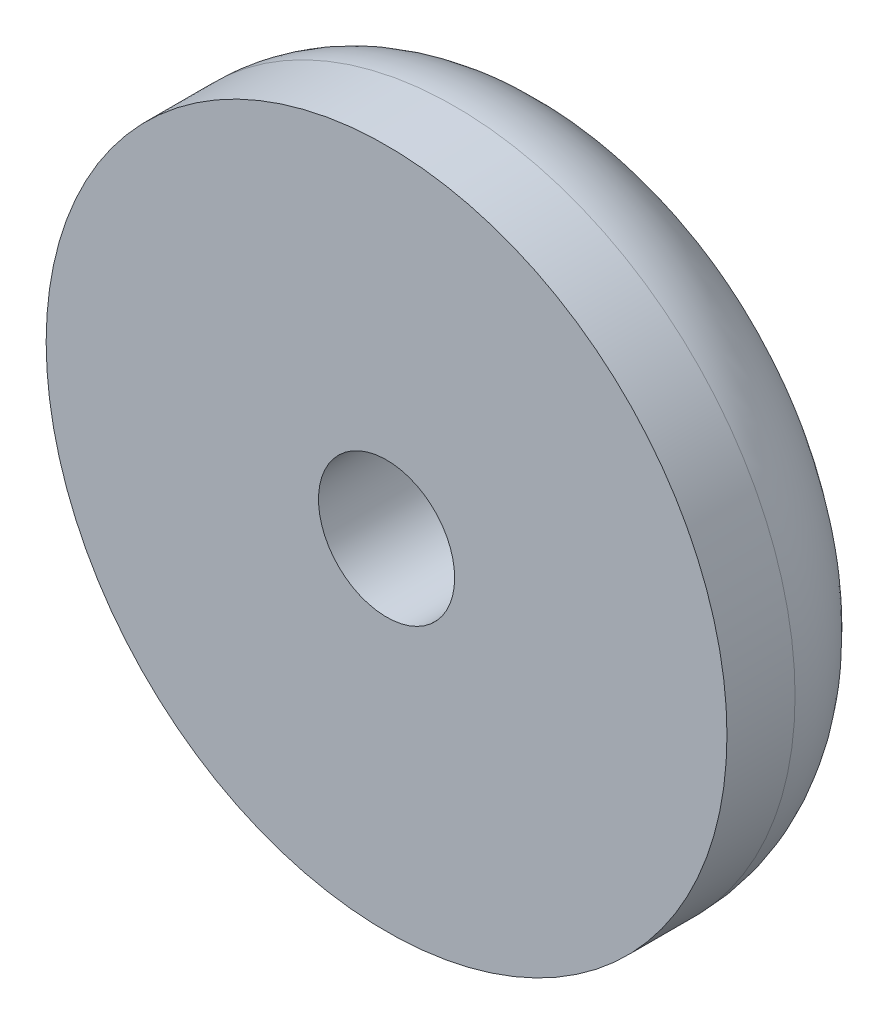
ISO-10303-21;
HEADER;
FILE_DESCRIPTION(('STEP AP214'),'2;1');
FILE_NAME('part.step','',(''),(''),'','','');
FILE_SCHEMA(('AUTOMOTIVE_DESIGN { 1 0 10303 214 1 1 1 1 }'));
ENDSEC;
DATA;
#1=APPLICATION_CONTEXT('core data for automotive mechanical design processes');
#2=APPLICATION_PROTOCOL_DEFINITION('international standard','automotive_design',2000,#1);
#3=PRODUCT_CONTEXT('',#1,'mechanical');
#4=PRODUCT('Part','Part','',(#3));
#5=PRODUCT_RELATED_PRODUCT_CATEGORY('part','',(#4));
#6=PRODUCT_DEFINITION_FORMATION('','',#4);
#7=PRODUCT_DEFINITION_CONTEXT('part definition',#1,'design');
#8=PRODUCT_DEFINITION('design','',#6,#7);
#9=PRODUCT_DEFINITION_SHAPE('','',#8);
#10=(LENGTH_UNIT() NAMED_UNIT(*) SI_UNIT(.MILLI.,.METRE.));
#11=(NAMED_UNIT(*) PLANE_ANGLE_UNIT() SI_UNIT($,.RADIAN.));
#12=(NAMED_UNIT(*) SI_UNIT($,.STERADIAN.) SOLID_ANGLE_UNIT());
#13=UNCERTAINTY_MEASURE_WITH_UNIT(LENGTH_MEASURE(1.E-05),#10,'distance_accuracy_value','');
#14=(GEOMETRIC_REPRESENTATION_CONTEXT(3) GLOBAL_UNCERTAINTY_ASSIGNED_CONTEXT((#13)) GLOBAL_UNIT_ASSIGNED_CONTEXT((#10,
#11,#12)) REPRESENTATION_CONTEXT('',''));
#15=CARTESIAN_POINT('',(0.,0.,0.));
#16=DIRECTION('',(0.,0.,1.));
#17=DIRECTION('',(1.,0.,0.));
#18=AXIS2_PLACEMENT_3D('',#15,#16,#17);
#19=CARTESIAN_POINT('',(0.,0.,4.));
#20=DIRECTION('',(0.,0.,1.));
#21=DIRECTION('',(1.,0.,0.));
#22=AXIS2_PLACEMENT_3D('',#19,#20,#21);
#23=PLANE('',#22);
#24=CARTESIAN_POINT('',(0.,0.,4.));
#25=DIRECTION('',(0.,0.,1.));
#26=DIRECTION('',(1.,0.,0.));
#27=AXIS2_PLACEMENT_3D('',#24,#25,#26);
#28=CIRCLE('',#27,7.5);
#29=CARTESIAN_POINT('',(7.5,0.,4.));
#30=VERTEX_POINT('',#29);
#31=EDGE_CURVE('E56',#30,#30,#28,.T.);
#32=ORIENTED_EDGE('',*,*,#31,.T.);
#33=EDGE_LOOP('',(#32));
#34=FACE_BOUND('',#33,.T.);
#35=CARTESIAN_POINT('',(0.,0.,4.));
#36=DIRECTION('',(0.,0.,1.));
#37=DIRECTION('',(1.,0.,0.));
#38=AXIS2_PLACEMENT_3D('',#35,#36,#37);
#39=CIRCLE('',#38,1.5);
#40=CARTESIAN_POINT('',(1.5,0.,4.));
#41=VERTEX_POINT('',#40);
#42=EDGE_CURVE('E61',#41,#41,#39,.T.);
#43=ORIENTED_EDGE('',*,*,#42,.F.);
#44=EDGE_LOOP('',(#43));
#45=FACE_BOUND('',#44,.T.);
#46=ADVANCED_FACE('F43',(#34,#45),#23,.T.);
#47=CARTESIAN_POINT('',(0.,0.,0.));
#48=DIRECTION('',(0.,0.,1.));
#49=DIRECTION('',(1.,0.,0.));
#50=AXIS2_PLACEMENT_3D('',#47,#48,#49);
#51=PLANE('',#50);
#52=CARTESIAN_POINT('',(0.,0.,0.));
#53=DIRECTION('',(0.,0.,1.));
#54=DIRECTION('',(1.,0.,0.));
#55=AXIS2_PLACEMENT_3D('',#52,#53,#54);
#56=CIRCLE('',#55,5.);
#57=CARTESIAN_POINT('',(5.,0.,0.));
#58=VERTEX_POINT('',#57);
#59=EDGE_CURVE('E10',#58,#58,#56,.F.);
#60=ORIENTED_EDGE('',*,*,#59,.T.);
#61=EDGE_LOOP('',(#60));
#62=FACE_BOUND('',#61,.T.);
#63=CARTESIAN_POINT('',(0.,0.,0.));
#64=DIRECTION('',(0.,0.,1.));
#65=DIRECTION('',(1.,0.,0.));
#66=AXIS2_PLACEMENT_3D('',#63,#64,#65);
#67=CIRCLE('',#66,1.5);
#68=CARTESIAN_POINT('',(1.5,0.,0.));
#69=VERTEX_POINT('',#68);
#70=EDGE_CURVE('E64',#69,#69,#67,.T.);
#71=ORIENTED_EDGE('',*,*,#70,.T.);
#72=EDGE_LOOP('',(#71));
#73=FACE_BOUND('',#72,.T.);
#74=ADVANCED_FACE('F76',(#62,#73),#51,.F.);
#75=CARTESIAN_POINT('',(0.,0.,4.));
#76=DIRECTION('',(0.,0.,-1.));
#77=DIRECTION('',(-1.,0.,0.));
#78=AXIS2_PLACEMENT_3D('',#75,#76,#77);
#79=CYLINDRICAL_SURFACE('',#78,7.5);
#80=CARTESIAN_POINT('',(0.,0.,2.5));
#81=DIRECTION('',(0.,0.,1.));
#82=DIRECTION('',(1.,0.,0.));
#83=AXIS2_PLACEMENT_3D('',#80,#81,#82);
#84=CIRCLE('',#83,7.5);
#85=CARTESIAN_POINT('',(7.5,0.,2.5));
#86=VERTEX_POINT('',#85);
#87=EDGE_CURVE('E51',#86,#86,#84,.T.);
#88=ORIENTED_EDGE('',*,*,#87,.T.);
#89=EDGE_LOOP('',(#88));
#90=FACE_BOUND('',#89,.T.);
#91=ORIENTED_EDGE('',*,*,#31,.F.);
#92=EDGE_LOOP('',(#91));
#93=FACE_BOUND('',#92,.T.);
#94=ADVANCED_FACE('F83',(#90,#93),#79,.T.);
#95=CARTESIAN_POINT('',(0.,0.,4.));
#96=DIRECTION('',(0.,0.,-1.));
#97=DIRECTION('',(-1.,0.,0.));
#98=AXIS2_PLACEMENT_3D('',#95,#96,#97);
#99=CYLINDRICAL_SURFACE('',#98,1.5);
#100=ORIENTED_EDGE('',*,*,#42,.T.);
#101=EDGE_LOOP('',(#100));
#102=FACE_BOUND('',#101,.T.);
#103=ORIENTED_EDGE('',*,*,#70,.F.);
#104=EDGE_LOOP('',(#103));
#105=FACE_BOUND('',#104,.T.);
#106=ADVANCED_FACE('F72',(#102,#105),#99,.F.);
#107=CARTESIAN_POINT('',(0.,0.,2.5));
#108=DIRECTION('',(0.,0.,1.));
#109=DIRECTION('',(1.,0.,0.));
#110=AXIS2_PLACEMENT_3D('',#107,#108,#109);
#111=TOROIDAL_SURFACE('',#110,5.,2.5);
#112=ORIENTED_EDGE('',*,*,#59,.F.);
#113=EDGE_LOOP('',(#112));
#114=FACE_BOUND('',#113,.T.);
#115=ORIENTED_EDGE('',*,*,#87,.F.);
#116=EDGE_LOOP('',(#115));
#117=FACE_BOUND('',#116,.T.);
#118=ADVANCED_FACE('F45',(#114,#117),#111,.T.);
#119=CLOSED_SHELL('',(#46,#74,#94,#106,#118));
#120=MANIFOLD_SOLID_BREP('B2',#119);
#121=ADVANCED_BREP_SHAPE_REPRESENTATION('',(#18,#120),#14);
#122=SHAPE_DEFINITION_REPRESENTATION(#9,#121);
ENDSEC;
END-ISO-10303-21;
